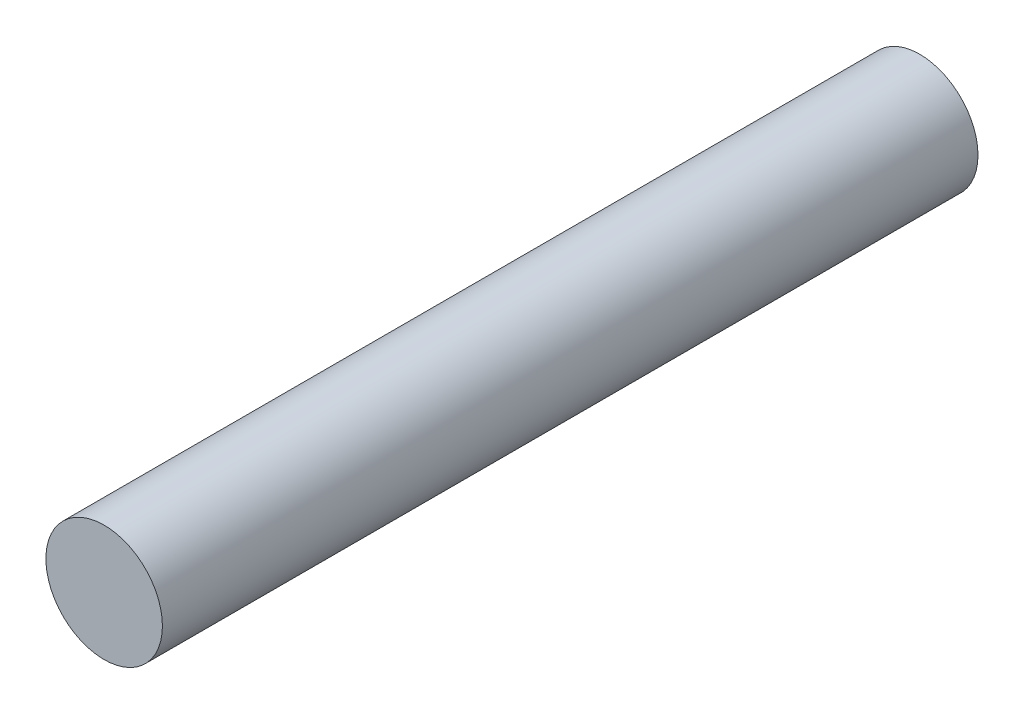
ISO-10303-21;
HEADER;
FILE_DESCRIPTION(('STEP AP214'),'2;1');
FILE_NAME('part.step','',(''),(''),'','','');
FILE_SCHEMA(('AUTOMOTIVE_DESIGN { 1 0 10303 214 1 1 1 1 }'));
ENDSEC;
DATA;
#1=APPLICATION_CONTEXT('core data for automotive mechanical design processes');
#2=APPLICATION_PROTOCOL_DEFINITION('international standard','automotive_design',2000,#1);
#3=PRODUCT_CONTEXT('',#1,'mechanical');
#4=PRODUCT('Part','Part','',(#3));
#5=PRODUCT_RELATED_PRODUCT_CATEGORY('part','',(#4));
#6=PRODUCT_DEFINITION_FORMATION('','',#4);
#7=PRODUCT_DEFINITION_CONTEXT('part definition',#1,'design');
#8=PRODUCT_DEFINITION('design','',#6,#7);
#9=PRODUCT_DEFINITION_SHAPE('','',#8);
#10=(LENGTH_UNIT() NAMED_UNIT(*) SI_UNIT(.MILLI.,.METRE.));
#11=(NAMED_UNIT(*) PLANE_ANGLE_UNIT() SI_UNIT($,.RADIAN.));
#12=(NAMED_UNIT(*) SI_UNIT($,.STERADIAN.) SOLID_ANGLE_UNIT());
#13=UNCERTAINTY_MEASURE_WITH_UNIT(LENGTH_MEASURE(1.E-05),#10,'distance_accuracy_value','');
#14=(GEOMETRIC_REPRESENTATION_CONTEXT(3) GLOBAL_UNCERTAINTY_ASSIGNED_CONTEXT((#13)) GLOBAL_UNIT_ASSIGNED_CONTEXT((#10,
#11,#12)) REPRESENTATION_CONTEXT('',''));
#15=CARTESIAN_POINT('',(0.,0.,0.));
#16=DIRECTION('',(0.,0.,1.));
#17=DIRECTION('',(1.,0.,0.));
#18=AXIS2_PLACEMENT_3D('',#15,#16,#17);
#19=CARTESIAN_POINT('',(0.,0.,-14.));
#20=DIRECTION('',(0.,0.,1.));
#21=DIRECTION('',(1.,0.,0.));
#22=AXIS2_PLACEMENT_3D('',#19,#20,#21);
#23=CYLINDRICAL_SURFACE('',#22,2.);
#24=CARTESIAN_POINT('',(0.,0.,-14.));
#25=DIRECTION('',(0.,0.,1.));
#26=DIRECTION('',(1.,0.,0.));
#27=AXIS2_PLACEMENT_3D('',#24,#25,#26);
#28=CIRCLE('',#27,2.);
#29=CARTESIAN_POINT('',(2.,0.,-14.));
#30=VERTEX_POINT('',#29);
#31=EDGE_CURVE('E10',#30,#30,#28,.T.);
#32=ORIENTED_EDGE('',*,*,#31,.T.);
#33=EDGE_LOOP('',(#32));
#34=FACE_BOUND('',#33,.T.);
#35=CARTESIAN_POINT('',(0.,0.,14.));
#36=DIRECTION('',(0.,0.,1.));
#37=DIRECTION('',(1.,0.,0.));
#38=AXIS2_PLACEMENT_3D('',#35,#36,#37);
#39=CIRCLE('',#38,2.);
#40=CARTESIAN_POINT('',(2.,0.,14.));
#41=VERTEX_POINT('',#40);
#42=EDGE_CURVE('E40',#41,#41,#39,.T.);
#43=ORIENTED_EDGE('',*,*,#42,.F.);
#44=EDGE_LOOP('',(#43));
#45=FACE_BOUND('',#44,.T.);
#46=ADVANCED_FACE('F37',(#34,#45),#23,.T.);
#47=CARTESIAN_POINT('',(0.,0.,-14.));
#48=DIRECTION('',(0.,0.,1.));
#49=DIRECTION('',(1.,0.,0.));
#50=AXIS2_PLACEMENT_3D('',#47,#48,#49);
#51=PLANE('',#50);
#52=ORIENTED_EDGE('',*,*,#31,.F.);
#53=EDGE_LOOP('',(#52));
#54=FACE_BOUND('',#53,.T.);
#55=ADVANCED_FACE('F54',(#54),#51,.F.);
#56=CARTESIAN_POINT('',(0.,0.,14.));
#57=DIRECTION('',(0.,0.,1.));
#58=DIRECTION('',(1.,0.,0.));
#59=AXIS2_PLACEMENT_3D('',#56,#57,#58);
#60=PLANE('',#59);
#61=ORIENTED_EDGE('',*,*,#42,.T.);
#62=EDGE_LOOP('',(#61));
#63=FACE_BOUND('',#62,.T.);
#64=ADVANCED_FACE('F51',(#63),#60,.T.);
#65=CLOSED_SHELL('',(#46,#55,#64));
#66=MANIFOLD_SOLID_BREP('B2',#65);
#67=ADVANCED_BREP_SHAPE_REPRESENTATION('',(#18,#66),#14);
#68=SHAPE_DEFINITION_REPRESENTATION(#9,#67);
ENDSEC;
END-ISO-10303-21;
